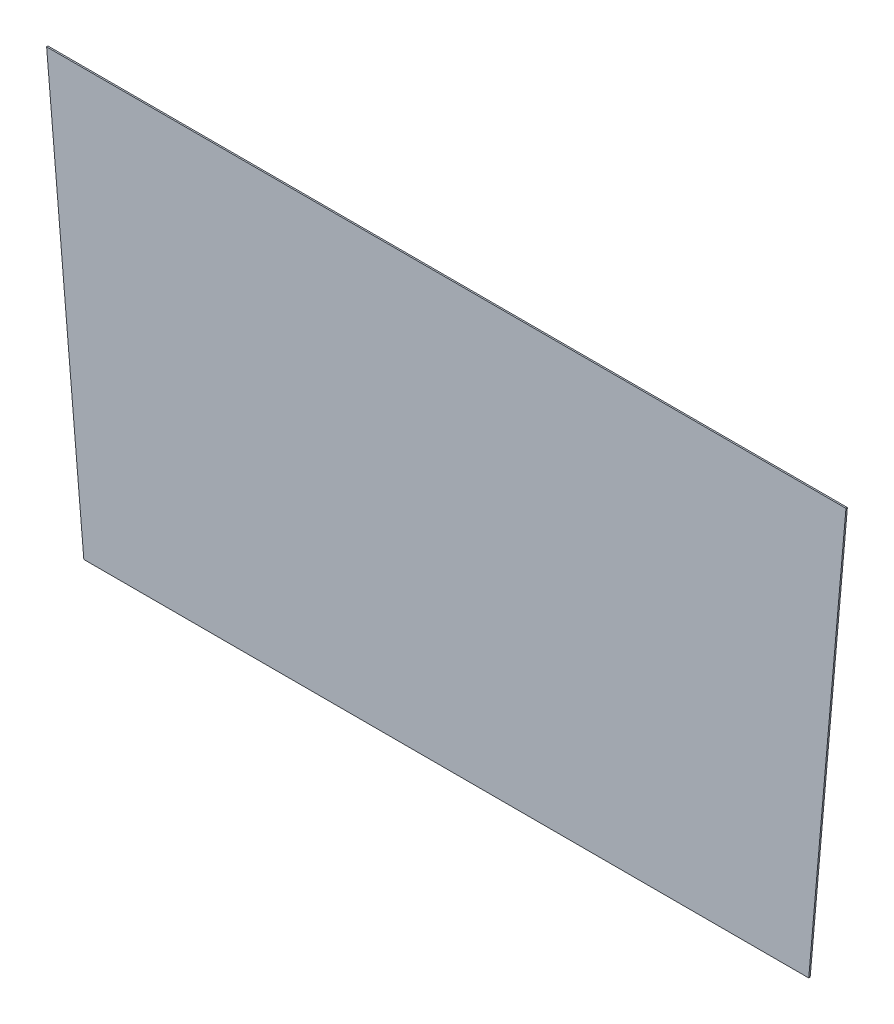
ISO-10303-21;
HEADER;
FILE_DESCRIPTION(('STEP AP214'),'2;1');
FILE_NAME('part.step','',(''),(''),'','','');
FILE_SCHEMA(('AUTOMOTIVE_DESIGN { 1 0 10303 214 1 1 1 1 }'));
ENDSEC;
DATA;
#1=APPLICATION_CONTEXT('core data for automotive mechanical design processes');
#2=APPLICATION_PROTOCOL_DEFINITION('international standard','automotive_design',2000,#1);
#3=PRODUCT_CONTEXT('',#1,'mechanical');
#4=PRODUCT('Part','Part','',(#3));
#5=PRODUCT_RELATED_PRODUCT_CATEGORY('part','',(#4));
#6=PRODUCT_DEFINITION_FORMATION('','',#4);
#7=PRODUCT_DEFINITION_CONTEXT('part definition',#1,'design');
#8=PRODUCT_DEFINITION('design','',#6,#7);
#9=PRODUCT_DEFINITION_SHAPE('','',#8);
#10=(LENGTH_UNIT() NAMED_UNIT(*) SI_UNIT(.MILLI.,.METRE.));
#11=(NAMED_UNIT(*) PLANE_ANGLE_UNIT() SI_UNIT($,.RADIAN.));
#12=(NAMED_UNIT(*) SI_UNIT($,.STERADIAN.) SOLID_ANGLE_UNIT());
#13=UNCERTAINTY_MEASURE_WITH_UNIT(LENGTH_MEASURE(1.E-05),#10,'distance_accuracy_value','');
#14=(GEOMETRIC_REPRESENTATION_CONTEXT(3) GLOBAL_UNCERTAINTY_ASSIGNED_CONTEXT((#13)) GLOBAL_UNIT_ASSIGNED_CONTEXT((#10,
#11,#12)) REPRESENTATION_CONTEXT('',''));
#15=CARTESIAN_POINT('',(0.,0.,0.));
#16=DIRECTION('',(0.,0.,1.));
#17=DIRECTION('',(1.,0.,0.));
#18=AXIS2_PLACEMENT_3D('',#15,#16,#17);
#19=CARTESIAN_POINT('',(-413.106924222601,-250.75623529668,1.5000000000001));
#20=DIRECTION('',(0.996194698091746,0.0871557427476549,0.));
#21=DIRECTION('',(-0.0871557427476549,0.996194698091746,0.));
#22=AXIS2_PLACEMENT_3D('',#19,#20,#21);
#23=PLANE('',#22);
#24=DIRECTION('',(0.0871557427476549,-0.996194698091746,0.));
#25=VECTOR('',#24,1.);
#26=CARTESIAN_POINT('',(-413.106924222601,-250.75623529668,1.03287424003972E-13));
#27=LINE('',#26,#25);
#28=CARTESIAN_POINT('',(-452.327008459045,197.531378844605,1.03287424003972E-13));
#29=VERTEX_POINT('',#28);
#30=CARTESIAN_POINT('',(-413.106924222601,-250.75623529668,1.03287424003972E-13));
#31=VERTEX_POINT('',#30);
#32=EDGE_CURVE('E96',#29,#31,#27,.T.);
#33=ORIENTED_EDGE('',*,*,#32,.T.);
#34=DIRECTION('',(0.,0.,-1.));
#35=VECTOR('',#34,1.);
#36=CARTESIAN_POINT('',(-413.106924222601,-250.75623529668,1.5000000000001));
#37=LINE('',#36,#35);
#38=CARTESIAN_POINT('',(-413.106924222601,-250.75623529668,1.5000000000001));
#39=VERTEX_POINT('',#38);
#40=EDGE_CURVE('E11',#39,#31,#37,.T.);
#41=ORIENTED_EDGE('',*,*,#40,.F.);
#42=DIRECTION('',(0.0871557427476549,-0.996194698091746,0.));
#43=VECTOR('',#42,1.);
#44=CARTESIAN_POINT('',(-413.106924222601,-250.75623529668,1.5000000000001));
#45=LINE('',#44,#43);
#46=CARTESIAN_POINT('',(-452.327008459045,197.531378844605,1.5000000000001));
#47=VERTEX_POINT('',#46);
#48=EDGE_CURVE('E84',#47,#39,#45,.T.);
#49=ORIENTED_EDGE('',*,*,#48,.F.);
#50=DIRECTION('',(0.,0.,-1.));
#51=VECTOR('',#50,1.);
#52=CARTESIAN_POINT('',(-452.327008459045,197.531378844605,1.5000000000001));
#53=LINE('',#52,#51);
#54=EDGE_CURVE('E92',#47,#29,#53,.T.);
#55=ORIENTED_EDGE('',*,*,#54,.T.);
#56=EDGE_LOOP('',(#33,#41,#49,#55));
#57=FACE_BOUND('',#56,.T.);
#58=ADVANCED_FACE('F33',(#57),#23,.F.);
#59=CARTESIAN_POINT('',(350.893075777399,-250.75623529668,1.5000000000001));
#60=DIRECTION('',(0.,1.,0.));
#61=DIRECTION('',(-1.,0.,0.));
#62=AXIS2_PLACEMENT_3D('',#59,#60,#61);
#63=PLANE('',#62);
#64=DIRECTION('',(1.,0.,0.));
#65=VECTOR('',#64,1.);
#66=CARTESIAN_POINT('',(350.893075777399,-250.75623529668,1.03287424003972E-13));
#67=LINE('',#66,#65);
#68=CARTESIAN_POINT('',(350.893075777399,-250.75623529668,1.03287424003972E-13));
#69=VERTEX_POINT('',#68);
#70=EDGE_CURVE('E88',#31,#69,#67,.T.);
#71=ORIENTED_EDGE('',*,*,#70,.T.);
#72=DIRECTION('',(0.,0.,-1.));
#73=VECTOR('',#72,1.);
#74=CARTESIAN_POINT('',(350.893075777399,-250.75623529668,1.5000000000001));
#75=LINE('',#74,#73);
#76=CARTESIAN_POINT('',(350.893075777399,-250.75623529668,1.5000000000001));
#77=VERTEX_POINT('',#76);
#78=EDGE_CURVE('E41',#77,#69,#75,.T.);
#79=ORIENTED_EDGE('',*,*,#78,.F.);
#80=DIRECTION('',(1.,0.,0.));
#81=VECTOR('',#80,1.);
#82=CARTESIAN_POINT('',(350.893075777399,-250.75623529668,1.5000000000001));
#83=LINE('',#82,#81);
#84=EDGE_CURVE('E79',#39,#77,#83,.T.);
#85=ORIENTED_EDGE('',*,*,#84,.F.);
#86=ORIENTED_EDGE('',*,*,#40,.T.);
#87=EDGE_LOOP('',(#71,#79,#85,#86));
#88=FACE_BOUND('',#87,.T.);
#89=ADVANCED_FACE('F87',(#88),#63,.F.);
#90=CARTESIAN_POINT('',(390.113160013844,197.531378844605,1.5000000000001));
#91=DIRECTION('',(-0.996194698091746,0.0871557427476542,0.));
#92=DIRECTION('',(-0.0871557427476542,-0.996194698091746,0.));
#93=AXIS2_PLACEMENT_3D('',#90,#91,#92);
#94=PLANE('',#93);
#95=DIRECTION('',(0.0871557427476542,0.996194698091746,0.));
#96=VECTOR('',#95,1.);
#97=CARTESIAN_POINT('',(390.113160013844,197.531378844605,1.03287424003972E-13));
#98=LINE('',#97,#96);
#99=CARTESIAN_POINT('',(390.113160013844,197.531378844605,1.03287424003972E-13));
#100=VERTEX_POINT('',#99);
#101=EDGE_CURVE('E66',#69,#100,#98,.T.);
#102=ORIENTED_EDGE('',*,*,#101,.T.);
#103=DIRECTION('',(0.,0.,-1.));
#104=VECTOR('',#103,1.);
#105=CARTESIAN_POINT('',(390.113160013844,197.531378844605,1.5000000000001));
#106=LINE('',#105,#104);
#107=CARTESIAN_POINT('',(390.113160013844,197.531378844605,1.5000000000001));
#108=VERTEX_POINT('',#107);
#109=EDGE_CURVE('E89',#108,#100,#106,.T.);
#110=ORIENTED_EDGE('',*,*,#109,.F.);
#111=DIRECTION('',(0.0871557427476542,0.996194698091746,0.));
#112=VECTOR('',#111,1.);
#113=CARTESIAN_POINT('',(390.113160013844,197.531378844605,1.5000000000001));
#114=LINE('',#113,#112);
#115=EDGE_CURVE('E82',#77,#108,#114,.T.);
#116=ORIENTED_EDGE('',*,*,#115,.F.);
#117=ORIENTED_EDGE('',*,*,#78,.T.);
#118=EDGE_LOOP('',(#102,#110,#116,#117));
#119=FACE_BOUND('',#118,.T.);
#120=ADVANCED_FACE('F90',(#119),#94,.F.);
#121=CARTESIAN_POINT('',(-452.327008459045,197.531378844605,1.5000000000001));
#122=DIRECTION('',(0.,-1.,0.));
#123=DIRECTION('',(1.,0.,0.));
#124=AXIS2_PLACEMENT_3D('',#121,#122,#123);
#125=PLANE('',#124);
#126=DIRECTION('',(-1.,0.,0.));
#127=VECTOR('',#126,1.);
#128=CARTESIAN_POINT('',(-452.327008459045,197.531378844605,1.03287424003972E-13));
#129=LINE('',#128,#127);
#130=EDGE_CURVE('E72',#100,#29,#129,.T.);
#131=ORIENTED_EDGE('',*,*,#130,.T.);
#132=ORIENTED_EDGE('',*,*,#54,.F.);
#133=DIRECTION('',(-1.,0.,0.));
#134=VECTOR('',#133,1.);
#135=CARTESIAN_POINT('',(-452.327008459045,197.531378844605,1.5000000000001));
#136=LINE('',#135,#134);
#137=EDGE_CURVE('E49',#108,#47,#136,.T.);
#138=ORIENTED_EDGE('',*,*,#137,.F.);
#139=ORIENTED_EDGE('',*,*,#109,.T.);
#140=EDGE_LOOP('',(#131,#132,#138,#139));
#141=FACE_BOUND('',#140,.T.);
#142=ADVANCED_FACE('F103',(#141),#125,.F.);
#143=CARTESIAN_POINT('',(0.,0.,1.5000000000001));
#144=DIRECTION('',(0.,0.,-1.));
#145=DIRECTION('',(-1.,0.,0.));
#146=AXIS2_PLACEMENT_3D('',#143,#144,#145);
#147=PLANE('',#146);
#148=ORIENTED_EDGE('',*,*,#48,.T.);
#149=ORIENTED_EDGE('',*,*,#84,.T.);
#150=ORIENTED_EDGE('',*,*,#115,.T.);
#151=ORIENTED_EDGE('',*,*,#137,.T.);
#152=EDGE_LOOP('',(#148,#149,#150,#151));
#153=FACE_BOUND('',#152,.T.);
#154=ADVANCED_FACE('F80',(#153),#147,.F.);
#155=CARTESIAN_POINT('',(0.,0.,1.03287424003972E-13));
#156=DIRECTION('',(0.,0.,-1.));
#157=DIRECTION('',(-1.,0.,0.));
#158=AXIS2_PLACEMENT_3D('',#155,#156,#157);
#159=PLANE('',#158);
#160=ORIENTED_EDGE('',*,*,#32,.F.);
#161=ORIENTED_EDGE('',*,*,#130,.F.);
#162=ORIENTED_EDGE('',*,*,#101,.F.);
#163=ORIENTED_EDGE('',*,*,#70,.F.);
#164=EDGE_LOOP('',(#160,#161,#162,#163));
#165=FACE_BOUND('',#164,.T.);
#166=ADVANCED_FACE('F106',(#165),#159,.T.);
#167=CLOSED_SHELL('',(#58,#89,#120,#142,#154,#166));
#168=MANIFOLD_SOLID_BREP('B2',#167);
#169=ADVANCED_BREP_SHAPE_REPRESENTATION('',(#18,#168),#14);
#170=SHAPE_DEFINITION_REPRESENTATION(#9,#169);
ENDSEC;
END-ISO-10303-21;
